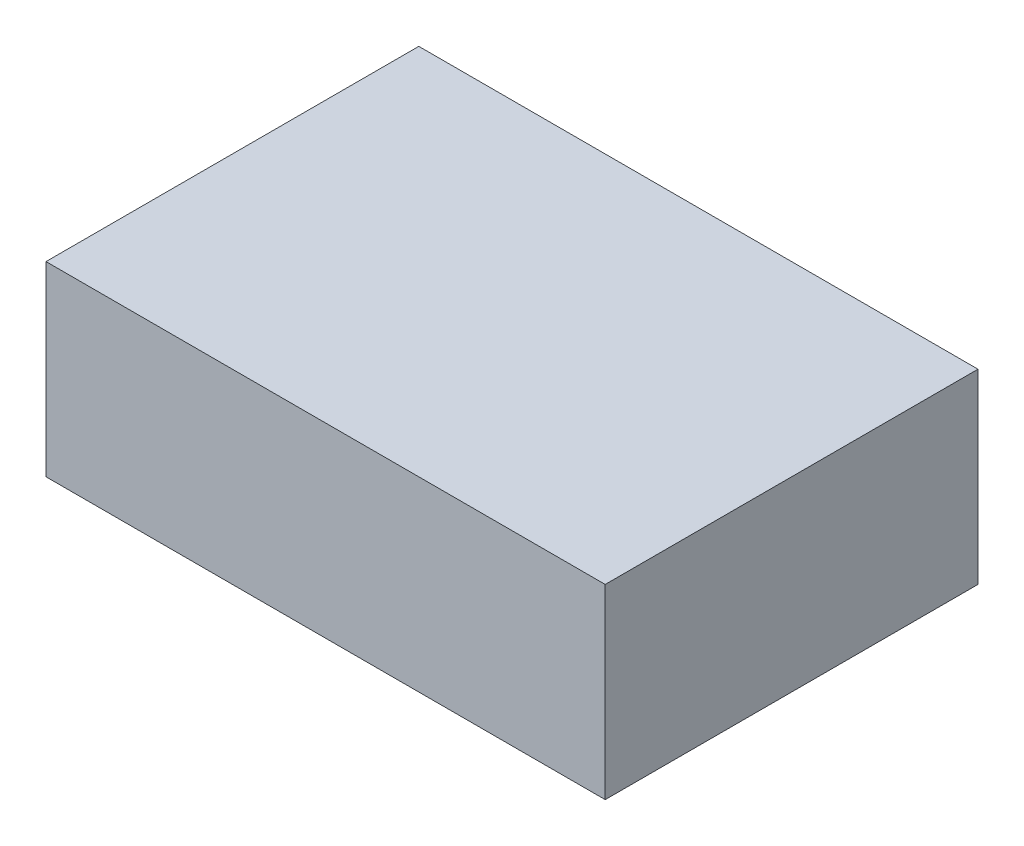
ISO-10303-21;
HEADER;
FILE_DESCRIPTION(('STEP AP214'),'2;1');
FILE_NAME('part.step','',(''),(''),'','','');
FILE_SCHEMA(('AUTOMOTIVE_DESIGN { 1 0 10303 214 1 1 1 1 }'));
ENDSEC;
DATA;
#1=APPLICATION_CONTEXT('core data for automotive mechanical design processes');
#2=APPLICATION_PROTOCOL_DEFINITION('international standard','automotive_design',2000,#1);
#3=PRODUCT_CONTEXT('',#1,'mechanical');
#4=PRODUCT('Part','Part','',(#3));
#5=PRODUCT_RELATED_PRODUCT_CATEGORY('part','',(#4));
#6=PRODUCT_DEFINITION_FORMATION('','',#4);
#7=PRODUCT_DEFINITION_CONTEXT('part definition',#1,'design');
#8=PRODUCT_DEFINITION('design','',#6,#7);
#9=PRODUCT_DEFINITION_SHAPE('','',#8);
#10=(LENGTH_UNIT() NAMED_UNIT(*) SI_UNIT(.MILLI.,.METRE.));
#11=(NAMED_UNIT(*) PLANE_ANGLE_UNIT() SI_UNIT($,.RADIAN.));
#12=(NAMED_UNIT(*) SI_UNIT($,.STERADIAN.) SOLID_ANGLE_UNIT());
#13=UNCERTAINTY_MEASURE_WITH_UNIT(LENGTH_MEASURE(1.E-05),#10,'distance_accuracy_value','');
#14=(GEOMETRIC_REPRESENTATION_CONTEXT(3) GLOBAL_UNCERTAINTY_ASSIGNED_CONTEXT((#13)) GLOBAL_UNIT_ASSIGNED_CONTEXT((#10,
#11,#12)) REPRESENTATION_CONTEXT('',''));
#15=CARTESIAN_POINT('',(0.,0.,0.));
#16=DIRECTION('',(0.,0.,1.));
#17=DIRECTION('',(1.,0.,0.));
#18=AXIS2_PLACEMENT_3D('',#15,#16,#17);
#19=CARTESIAN_POINT('',(0.,0.,100.));
#20=DIRECTION('',(1.,0.,0.));
#21=DIRECTION('',(0.,0.,-1.));
#22=AXIS2_PLACEMENT_3D('',#19,#20,#21);
#23=PLANE('',#22);
#24=DIRECTION('',(0.,0.,-1.));
#25=VECTOR('',#24,1.);
#26=CARTESIAN_POINT('',(0.,30.,85.));
#27=LINE('',#26,#25);
#28=CARTESIAN_POINT('',(0.,30.,85.));
#29=VERTEX_POINT('',#28);
#30=CARTESIAN_POINT('',(0.,30.,15.));
#31=VERTEX_POINT('',#30);
#32=EDGE_CURVE('E117',#29,#31,#27,.T.);
#33=ORIENTED_EDGE('',*,*,#32,.F.);
#34=DIRECTION('',(0.,-1.,0.));
#35=VECTOR('',#34,1.);
#36=CARTESIAN_POINT('',(0.,30.,85.));
#37=LINE('',#36,#35);
#38=CARTESIAN_POINT('',(0.,0.,85.));
#39=VERTEX_POINT('',#38);
#40=EDGE_CURVE('E146',#29,#39,#37,.T.);
#41=ORIENTED_EDGE('',*,*,#40,.T.);
#42=DIRECTION('',(0.,0.,-1.));
#43=VECTOR('',#42,1.);
#44=CARTESIAN_POINT('',(0.,0.,100.));
#45=LINE('',#44,#43);
#46=CARTESIAN_POINT('',(0.,0.,100.));
#47=VERTEX_POINT('',#46);
#48=EDGE_CURVE('E11',#47,#39,#45,.T.);
#49=ORIENTED_EDGE('',*,*,#48,.F.);
#50=DIRECTION('',(0.,-1.,0.));
#51=VECTOR('',#50,1.);
#52=CARTESIAN_POINT('',(0.,0.,100.));
#53=LINE('',#52,#51);
#54=CARTESIAN_POINT('',(0.,50.,100.));
#55=VERTEX_POINT('',#54);
#56=EDGE_CURVE('E136',#55,#47,#53,.T.);
#57=ORIENTED_EDGE('',*,*,#56,.F.);
#58=DIRECTION('',(0.,0.,-1.));
#59=VECTOR('',#58,1.);
#60=CARTESIAN_POINT('',(0.,50.,100.));
#61=LINE('',#60,#59);
#62=CARTESIAN_POINT('',(0.,50.,0.));
#63=VERTEX_POINT('',#62);
#64=EDGE_CURVE('E142',#55,#63,#61,.T.);
#65=ORIENTED_EDGE('',*,*,#64,.T.);
#66=DIRECTION('',(0.,-1.,0.));
#67=VECTOR('',#66,1.);
#68=CARTESIAN_POINT('',(0.,0.,0.));
#69=LINE('',#68,#67);
#70=CARTESIAN_POINT('',(0.,0.,0.));
#71=VERTEX_POINT('',#70);
#72=EDGE_CURVE('E143',#63,#71,#69,.T.);
#73=ORIENTED_EDGE('',*,*,#72,.T.);
#74=CARTESIAN_POINT('',(0.,0.,15.));
#75=VERTEX_POINT('',#74);
#76=EDGE_CURVE('E44',#75,#71,#45,.T.);
#77=ORIENTED_EDGE('',*,*,#76,.F.);
#78=DIRECTION('',(0.,-1.,0.));
#79=VECTOR('',#78,1.);
#80=CARTESIAN_POINT('',(0.,30.,15.));
#81=LINE('',#80,#79);
#82=EDGE_CURVE('E51',#31,#75,#81,.T.);
#83=ORIENTED_EDGE('',*,*,#82,.F.);
#84=EDGE_LOOP('',(#33,#41,#49,#57,#65,#73,#77,#83));
#85=FACE_BOUND('',#84,.T.);
#86=ADVANCED_FACE('F37',(#85),#23,.F.);
#87=CARTESIAN_POINT('',(0.,0.,100.));
#88=DIRECTION('',(0.,1.,0.));
#89=DIRECTION('',(0.,0.,1.));
#90=AXIS2_PLACEMENT_3D('',#87,#88,#89);
#91=PLANE('',#90);
#92=ORIENTED_EDGE('',*,*,#48,.T.);
#93=DIRECTION('',(-1.,0.,0.));
#94=VECTOR('',#93,1.);
#95=CARTESIAN_POINT('',(0.,0.,85.));
#96=LINE('',#95,#94);
#97=CARTESIAN_POINT('',(53.6470124599621,0.,85.));
#98=VERTEX_POINT('',#97);
#99=EDGE_CURVE('E126',#98,#39,#96,.T.);
#100=ORIENTED_EDGE('',*,*,#99,.F.);
#101=DIRECTION('',(0.,0.,1.));
#102=VECTOR('',#101,1.);
#103=CARTESIAN_POINT('',(53.6470124599621,0.,85.));
#104=LINE('',#103,#102);
#105=CARTESIAN_POINT('',(53.6470124599621,0.,15.));
#106=VERTEX_POINT('',#105);
#107=EDGE_CURVE('E173',#106,#98,#104,.T.);
#108=ORIENTED_EDGE('',*,*,#107,.F.);
#109=DIRECTION('',(1.,0.,0.));
#110=VECTOR('',#109,1.);
#111=CARTESIAN_POINT('',(0.,0.,15.));
#112=LINE('',#111,#110);
#113=EDGE_CURVE('E161',#75,#106,#112,.T.);
#114=ORIENTED_EDGE('',*,*,#113,.F.);
#115=ORIENTED_EDGE('',*,*,#76,.T.);
#116=DIRECTION('',(1.,0.,0.));
#117=VECTOR('',#116,1.);
#118=CARTESIAN_POINT('',(0.,0.,0.));
#119=LINE('',#118,#117);
#120=CARTESIAN_POINT('',(150.,0.,0.));
#121=VERTEX_POINT('',#120);
#122=EDGE_CURVE('E145',#71,#121,#119,.T.);
#123=ORIENTED_EDGE('',*,*,#122,.T.);
#124=DIRECTION('',(0.,0.,-1.));
#125=VECTOR('',#124,1.);
#126=CARTESIAN_POINT('',(150.,0.,100.));
#127=LINE('',#126,#125);
#128=CARTESIAN_POINT('',(150.,0.,100.));
#129=VERTEX_POINT('',#128);
#130=EDGE_CURVE('E153',#129,#121,#127,.T.);
#131=ORIENTED_EDGE('',*,*,#130,.F.);
#132=DIRECTION('',(1.,0.,0.));
#133=VECTOR('',#132,1.);
#134=CARTESIAN_POINT('',(0.,0.,100.));
#135=LINE('',#134,#133);
#136=EDGE_CURVE('E88',#47,#129,#135,.T.);
#137=ORIENTED_EDGE('',*,*,#136,.F.);
#138=EDGE_LOOP('',(#92,#100,#108,#114,#115,#123,#131,#137));
#139=FACE_BOUND('',#138,.T.);
#140=ADVANCED_FACE('F159',(#139),#91,.F.);
#141=CARTESIAN_POINT('',(150.,0.,100.));
#142=DIRECTION('',(-1.,0.,0.));
#143=DIRECTION('',(0.,0.,1.));
#144=AXIS2_PLACEMENT_3D('',#141,#142,#143);
#145=PLANE('',#144);
#146=DIRECTION('',(0.,1.,0.));
#147=VECTOR('',#146,1.);
#148=CARTESIAN_POINT('',(150.,0.,0.));
#149=LINE('',#148,#147);
#150=CARTESIAN_POINT('',(150.,50.,0.));
#151=VERTEX_POINT('',#150);
#152=EDGE_CURVE('E148',#121,#151,#149,.T.);
#153=ORIENTED_EDGE('',*,*,#152,.T.);
#154=DIRECTION('',(0.,0.,-1.));
#155=VECTOR('',#154,1.);
#156=CARTESIAN_POINT('',(150.,50.,100.));
#157=LINE('',#156,#155);
#158=CARTESIAN_POINT('',(150.,50.,100.));
#159=VERTEX_POINT('',#158);
#160=EDGE_CURVE('E152',#159,#151,#157,.T.);
#161=ORIENTED_EDGE('',*,*,#160,.F.);
#162=DIRECTION('',(0.,1.,0.));
#163=VECTOR('',#162,1.);
#164=CARTESIAN_POINT('',(150.,0.,100.));
#165=LINE('',#164,#163);
#166=EDGE_CURVE('E139',#129,#159,#165,.T.);
#167=ORIENTED_EDGE('',*,*,#166,.F.);
#168=ORIENTED_EDGE('',*,*,#130,.T.);
#169=EDGE_LOOP('',(#153,#161,#167,#168));
#170=FACE_BOUND('',#169,.T.);
#171=ADVANCED_FACE('F169',(#170),#145,.F.);
#172=CARTESIAN_POINT('',(0.,50.,100.));
#173=DIRECTION('',(0.,-1.,0.));
#174=DIRECTION('',(0.,0.,-1.));
#175=AXIS2_PLACEMENT_3D('',#172,#173,#174);
#176=PLANE('',#175);
#177=DIRECTION('',(-1.,0.,0.));
#178=VECTOR('',#177,1.);
#179=CARTESIAN_POINT('',(0.,50.,0.));
#180=LINE('',#179,#178);
#181=EDGE_CURVE('E81',#151,#63,#180,.T.);
#182=ORIENTED_EDGE('',*,*,#181,.T.);
#183=ORIENTED_EDGE('',*,*,#64,.F.);
#184=DIRECTION('',(-1.,0.,0.));
#185=VECTOR('',#184,1.);
#186=CARTESIAN_POINT('',(0.,50.,100.));
#187=LINE('',#186,#185);
#188=EDGE_CURVE('E60',#159,#55,#187,.T.);
#189=ORIENTED_EDGE('',*,*,#188,.F.);
#190=ORIENTED_EDGE('',*,*,#160,.T.);
#191=EDGE_LOOP('',(#182,#183,#189,#190));
#192=FACE_BOUND('',#191,.T.);
#193=ADVANCED_FACE('F167',(#192),#176,.F.);
#194=CARTESIAN_POINT('',(0.,0.,100.));
#195=DIRECTION('',(0.,0.,-1.));
#196=DIRECTION('',(-1.,0.,0.));
#197=AXIS2_PLACEMENT_3D('',#194,#195,#196);
#198=PLANE('',#197);
#199=ORIENTED_EDGE('',*,*,#56,.T.);
#200=ORIENTED_EDGE('',*,*,#136,.T.);
#201=ORIENTED_EDGE('',*,*,#166,.T.);
#202=ORIENTED_EDGE('',*,*,#188,.T.);
#203=EDGE_LOOP('',(#199,#200,#201,#202));
#204=FACE_BOUND('',#203,.T.);
#205=ADVANCED_FACE('F170',(#204),#198,.F.);
#206=CARTESIAN_POINT('',(0.,0.,0.));
#207=DIRECTION('',(0.,0.,-1.));
#208=DIRECTION('',(-1.,0.,0.));
#209=AXIS2_PLACEMENT_3D('',#206,#207,#208);
#210=PLANE('',#209);
#211=ORIENTED_EDGE('',*,*,#72,.F.);
#212=ORIENTED_EDGE('',*,*,#181,.F.);
#213=ORIENTED_EDGE('',*,*,#152,.F.);
#214=ORIENTED_EDGE('',*,*,#122,.F.);
#215=EDGE_LOOP('',(#211,#212,#213,#214));
#216=FACE_BOUND('',#215,.T.);
#217=ADVANCED_FACE('F164',(#216),#210,.T.);
#218=CARTESIAN_POINT('',(0.,30.,85.));
#219=DIRECTION('',(0.,0.,1.));
#220=DIRECTION('',(1.,0.,0.));
#221=AXIS2_PLACEMENT_3D('',#218,#219,#220);
#222=PLANE('',#221);
#223=ORIENTED_EDGE('',*,*,#99,.T.);
#224=ORIENTED_EDGE('',*,*,#40,.F.);
#225=DIRECTION('',(-1.,0.,0.));
#226=VECTOR('',#225,1.);
#227=CARTESIAN_POINT('',(0.,30.,85.));
#228=LINE('',#227,#226);
#229=CARTESIAN_POINT('',(53.6470124599621,30.,85.));
#230=VERTEX_POINT('',#229);
#231=EDGE_CURVE('E123',#230,#29,#228,.T.);
#232=ORIENTED_EDGE('',*,*,#231,.F.);
#233=DIRECTION('',(0.,-1.,0.));
#234=VECTOR('',#233,1.);
#235=CARTESIAN_POINT('',(53.6470124599621,30.,85.));
#236=LINE('',#235,#234);
#237=EDGE_CURVE('E131',#230,#98,#236,.T.);
#238=ORIENTED_EDGE('',*,*,#237,.T.);
#239=EDGE_LOOP('',(#223,#224,#232,#238));
#240=FACE_BOUND('',#239,.T.);
#241=ADVANCED_FACE('F179',(#240),#222,.F.);
#242=CARTESIAN_POINT('',(53.6470124599621,30.,85.));
#243=DIRECTION('',(1.,0.,0.));
#244=DIRECTION('',(0.,0.,-1.));
#245=AXIS2_PLACEMENT_3D('',#242,#243,#244);
#246=PLANE('',#245);
#247=ORIENTED_EDGE('',*,*,#107,.T.);
#248=ORIENTED_EDGE('',*,*,#237,.F.);
#249=DIRECTION('',(0.,0.,1.));
#250=VECTOR('',#249,1.);
#251=CARTESIAN_POINT('',(53.6470124599621,30.,85.));
#252=LINE('',#251,#250);
#253=CARTESIAN_POINT('',(53.6470124599621,30.,15.));
#254=VERTEX_POINT('',#253);
#255=EDGE_CURVE('E116',#254,#230,#252,.T.);
#256=ORIENTED_EDGE('',*,*,#255,.F.);
#257=DIRECTION('',(0.,-1.,0.));
#258=VECTOR('',#257,1.);
#259=CARTESIAN_POINT('',(53.6470124599621,30.,15.));
#260=LINE('',#259,#258);
#261=EDGE_CURVE('E112',#254,#106,#260,.T.);
#262=ORIENTED_EDGE('',*,*,#261,.T.);
#263=EDGE_LOOP('',(#247,#248,#256,#262));
#264=FACE_BOUND('',#263,.T.);
#265=ADVANCED_FACE('F181',(#264),#246,.F.);
#266=CARTESIAN_POINT('',(0.,30.,15.));
#267=DIRECTION('',(0.,0.,-1.));
#268=DIRECTION('',(-1.,0.,0.));
#269=AXIS2_PLACEMENT_3D('',#266,#267,#268);
#270=PLANE('',#269);
#271=ORIENTED_EDGE('',*,*,#113,.T.);
#272=ORIENTED_EDGE('',*,*,#261,.F.);
#273=DIRECTION('',(1.,0.,0.));
#274=VECTOR('',#273,1.);
#275=CARTESIAN_POINT('',(0.,30.,15.));
#276=LINE('',#275,#274);
#277=EDGE_CURVE('E109',#31,#254,#276,.T.);
#278=ORIENTED_EDGE('',*,*,#277,.F.);
#279=ORIENTED_EDGE('',*,*,#82,.T.);
#280=EDGE_LOOP('',(#271,#272,#278,#279));
#281=FACE_BOUND('',#280,.T.);
#282=ADVANCED_FACE('F111',(#281),#270,.F.);
#283=CARTESIAN_POINT('',(0.,30.,0.));
#284=DIRECTION('',(0.,-1.,0.));
#285=DIRECTION('',(0.,0.,-1.));
#286=AXIS2_PLACEMENT_3D('',#283,#284,#285);
#287=PLANE('',#286);
#288=ORIENTED_EDGE('',*,*,#32,.T.);
#289=ORIENTED_EDGE('',*,*,#277,.T.);
#290=ORIENTED_EDGE('',*,*,#255,.T.);
#291=ORIENTED_EDGE('',*,*,#231,.T.);
#292=EDGE_LOOP('',(#288,#289,#290,#291));
#293=FACE_BOUND('',#292,.T.);
#294=ADVANCED_FACE('F121',(#293),#287,.T.);
#295=CLOSED_SHELL('',(#86,#140,#171,#193,#205,#217,#241,#265,#282,#294));
#296=MANIFOLD_SOLID_BREP('B2',#295);
#297=ADVANCED_BREP_SHAPE_REPRESENTATION('',(#18,#296),#14);
#298=SHAPE_DEFINITION_REPRESENTATION(#9,#297);
ENDSEC;
END-ISO-10303-21;
